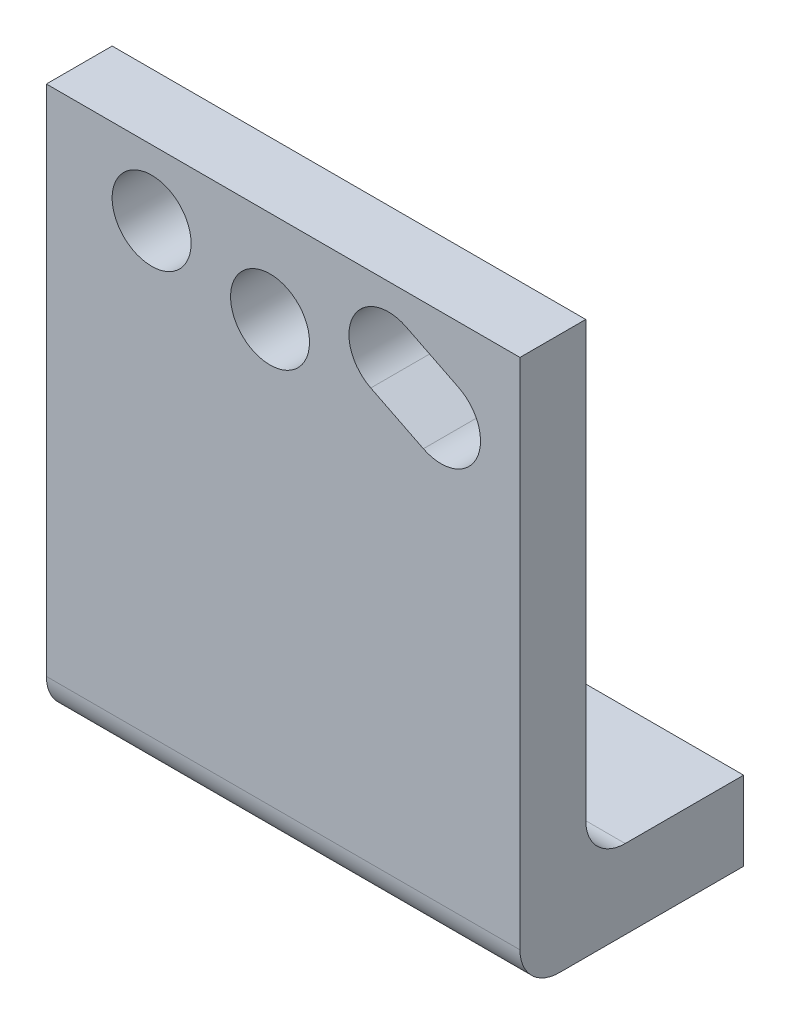
ISO-10303-21;
HEADER;
FILE_DESCRIPTION(('STEP AP214'),'2;1');
FILE_NAME('part.step','',(''),(''),'','','');
FILE_SCHEMA(('AUTOMOTIVE_DESIGN { 1 0 10303 214 1 1 1 1 }'));
ENDSEC;
DATA;
#1=APPLICATION_CONTEXT('core data for automotive mechanical design processes');
#2=APPLICATION_PROTOCOL_DEFINITION('international standard','automotive_design',2000,#1);
#3=PRODUCT_CONTEXT('',#1,'mechanical');
#4=PRODUCT('Part','Part','',(#3));
#5=PRODUCT_RELATED_PRODUCT_CATEGORY('part','',(#4));
#6=PRODUCT_DEFINITION_FORMATION('','',#4);
#7=PRODUCT_DEFINITION_CONTEXT('part definition',#1,'design');
#8=PRODUCT_DEFINITION('design','',#6,#7);
#9=PRODUCT_DEFINITION_SHAPE('','',#8);
#10=(LENGTH_UNIT() NAMED_UNIT(*) SI_UNIT(.MILLI.,.METRE.));
#11=(NAMED_UNIT(*) PLANE_ANGLE_UNIT() SI_UNIT($,.RADIAN.));
#12=(NAMED_UNIT(*) SI_UNIT($,.STERADIAN.) SOLID_ANGLE_UNIT());
#13=UNCERTAINTY_MEASURE_WITH_UNIT(LENGTH_MEASURE(1.E-05),#10,'distance_accuracy_value','');
#14=(GEOMETRIC_REPRESENTATION_CONTEXT(3) GLOBAL_UNCERTAINTY_ASSIGNED_CONTEXT((#13)) GLOBAL_UNIT_ASSIGNED_CONTEXT((#10,
#11,#12)) REPRESENTATION_CONTEXT('',''));
#15=CARTESIAN_POINT('',(0.,0.,0.));
#16=DIRECTION('',(0.,0.,1.));
#17=DIRECTION('',(1.,0.,0.));
#18=AXIS2_PLACEMENT_3D('',#15,#16,#17);
#19=CARTESIAN_POINT('',(0.,0.,0.));
#20=DIRECTION('',(0.,0.,1.));
#21=DIRECTION('',(1.,0.,0.));
#22=AXIS2_PLACEMENT_3D('',#19,#20,#21);
#23=PLANE('',#22);
#24=CARTESIAN_POINT('',(-5.,8.,0.));
#25=DIRECTION('',(0.,0.,1.));
#26=DIRECTION('',(1.,0.,0.));
#27=AXIS2_PLACEMENT_3D('',#24,#25,#26);
#28=CIRCLE('',#27,1.5);
#29=CARTESIAN_POINT('',(-3.5,8.,0.));
#30=VERTEX_POINT('',#29);
#31=EDGE_CURVE('E193',#30,#30,#28,.T.);
#32=ORIENTED_EDGE('',*,*,#31,.T.);
#33=EDGE_LOOP('',(#32));
#34=FACE_BOUND('',#33,.T.);
#35=CARTESIAN_POINT('',(6.,7.,0.));
#36=DIRECTION('',(0.,0.,1.));
#37=DIRECTION('',(1.,0.,0.));
#38=AXIS2_PLACEMENT_3D('',#35,#36,#37);
#39=CIRCLE('',#38,1.5);
#40=CARTESIAN_POINT('',(5.32917960675007,5.65835921350013,0.));
#41=VERTEX_POINT('',#40);
#42=CARTESIAN_POINT('',(6.67082039324994,8.34164078649988,0.));
#43=VERTEX_POINT('',#42);
#44=EDGE_CURVE('E181',#41,#43,#39,.T.);
#45=ORIENTED_EDGE('',*,*,#44,.T.);
#46=DIRECTION('',(0.894427190999916,-0.447213595499958,0.));
#47=VECTOR('',#46,1.);
#48=CARTESIAN_POINT('',(4.67082039324993,9.34164078649988,0.));
#49=LINE('',#48,#47);
#50=CARTESIAN_POINT('',(4.67082039324994,9.34164078649987,0.));
#51=VERTEX_POINT('',#50);
#52=EDGE_CURVE('E190',#51,#43,#49,.T.);
#53=ORIENTED_EDGE('',*,*,#52,.F.);
#54=CARTESIAN_POINT('',(4.,8.,0.));
#55=DIRECTION('',(0.,0.,1.));
#56=DIRECTION('',(1.,0.,0.));
#57=AXIS2_PLACEMENT_3D('',#54,#55,#56);
#58=CIRCLE('',#57,1.5);
#59=CARTESIAN_POINT('',(3.32917960675006,6.65835921350013,0.));
#60=VERTEX_POINT('',#59);
#61=EDGE_CURVE('E187',#51,#60,#58,.T.);
#62=ORIENTED_EDGE('',*,*,#61,.T.);
#63=DIRECTION('',(-0.894427190999916,0.447213595499958,0.));
#64=VECTOR('',#63,1.);
#65=CARTESIAN_POINT('',(3.32917960675006,6.65835921350013,0.));
#66=LINE('',#65,#64);
#67=EDGE_CURVE('E184',#41,#60,#66,.T.);
#68=ORIENTED_EDGE('',*,*,#67,.F.);
#69=EDGE_LOOP('',(#45,#53,#62,#68));
#70=FACE_BOUND('',#69,.T.);
#71=CARTESIAN_POINT('',(-0.499999999999998,7.,0.));
#72=DIRECTION('',(0.,0.,1.));
#73=DIRECTION('',(1.,0.,0.));
#74=AXIS2_PLACEMENT_3D('',#71,#72,#73);
#75=CIRCLE('',#74,1.5);
#76=CARTESIAN_POINT('',(1.,7.,0.));
#77=VERTEX_POINT('',#76);
#78=EDGE_CURVE('E150',#77,#77,#75,.T.);
#79=ORIENTED_EDGE('',*,*,#78,.T.);
#80=EDGE_LOOP('',(#79));
#81=FACE_BOUND('',#80,.T.);
#82=DIRECTION('',(0.,-1.,0.));
#83=VECTOR('',#82,1.);
#84=CARTESIAN_POINT('',(9.00000000000001,0.,0.));
#85=LINE('',#84,#83);
#86=CARTESIAN_POINT('',(9.,10.5,0.));
#87=VERTEX_POINT('',#86);
#88=CARTESIAN_POINT('',(9.00000000000001,-6.,0.));
#89=VERTEX_POINT('',#88);
#90=EDGE_CURVE('E198',#87,#89,#85,.T.);
#91=ORIENTED_EDGE('',*,*,#90,.T.);
#92=DIRECTION('',(1.,0.,0.));
#93=VECTOR('',#92,1.);
#94=CARTESIAN_POINT('',(-9.,-6.,0.));
#95=LINE('',#94,#93);
#96=CARTESIAN_POINT('',(-9.,-6.,0.));
#97=VERTEX_POINT('',#96);
#98=EDGE_CURVE('E56',#89,#97,#95,.F.);
#99=ORIENTED_EDGE('',*,*,#98,.T.);
#100=DIRECTION('',(0.,-1.,0.));
#101=VECTOR('',#100,1.);
#102=CARTESIAN_POINT('',(-9.,0.,0.));
#103=LINE('',#102,#101);
#104=CARTESIAN_POINT('',(-9.,10.5,0.));
#105=VERTEX_POINT('',#104);
#106=EDGE_CURVE('E196',#105,#97,#103,.T.);
#107=ORIENTED_EDGE('',*,*,#106,.F.);
#108=DIRECTION('',(1.,0.,0.));
#109=VECTOR('',#108,1.);
#110=CARTESIAN_POINT('',(0.,10.5,0.));
#111=LINE('',#110,#109);
#112=EDGE_CURVE('E156',#105,#87,#111,.T.);
#113=ORIENTED_EDGE('',*,*,#112,.T.);
#114=EDGE_LOOP('',(#91,#99,#107,#113));
#115=FACE_BOUND('',#114,.T.);
#116=ADVANCED_FACE('F35',(#34,#70,#81,#115),#23,.F.);
#117=CARTESIAN_POINT('',(-9.,0.,2.5));
#118=DIRECTION('',(1.,0.,0.));
#119=DIRECTION('',(0.,1.,0.));
#120=AXIS2_PLACEMENT_3D('',#117,#118,#119);
#121=PLANE('',#120);
#122=DIRECTION('',(0.,0.,-1.));
#123=VECTOR('',#122,1.);
#124=CARTESIAN_POINT('',(-9.,-10.5,2.5));
#125=LINE('',#124,#123);
#126=CARTESIAN_POINT('',(-9.,-10.5,1.));
#127=VERTEX_POINT('',#126);
#128=CARTESIAN_POINT('',(-9.,-10.5,-6.));
#129=VERTEX_POINT('',#128);
#130=EDGE_CURVE('E209',#127,#129,#125,.T.);
#131=ORIENTED_EDGE('',*,*,#130,.F.);
#132=CARTESIAN_POINT('',(-9.,-9.,1.));
#133=DIRECTION('',(1.,0.,0.));
#134=DIRECTION('',(0.,1.,0.));
#135=AXIS2_PLACEMENT_3D('',#132,#133,#134);
#136=CIRCLE('',#135,1.5);
#137=CARTESIAN_POINT('',(-9.,-9.,2.5));
#138=VERTEX_POINT('',#137);
#139=EDGE_CURVE('E224',#127,#138,#136,.F.);
#140=ORIENTED_EDGE('',*,*,#139,.T.);
#141=DIRECTION('',(0.,-1.,0.));
#142=VECTOR('',#141,1.);
#143=CARTESIAN_POINT('',(-9.,0.,2.5));
#144=LINE('',#143,#142);
#145=CARTESIAN_POINT('',(-9.,10.5,2.5));
#146=VERTEX_POINT('',#145);
#147=EDGE_CURVE('E169',#146,#138,#144,.T.);
#148=ORIENTED_EDGE('',*,*,#147,.F.);
#149=DIRECTION('',(0.,0.,-1.));
#150=VECTOR('',#149,1.);
#151=CARTESIAN_POINT('',(-9.,10.5,2.5));
#152=LINE('',#151,#150);
#153=EDGE_CURVE('E202',#146,#105,#152,.T.);
#154=ORIENTED_EDGE('',*,*,#153,.T.);
#155=ORIENTED_EDGE('',*,*,#106,.T.);
#156=CARTESIAN_POINT('',(-9.,-6.,-1.5));
#157=DIRECTION('',(1.,0.,0.));
#158=DIRECTION('',(0.,1.,0.));
#159=AXIS2_PLACEMENT_3D('',#156,#157,#158);
#160=CIRCLE('',#159,1.5);
#161=CARTESIAN_POINT('',(-9.,-7.5,-1.5));
#162=VERTEX_POINT('',#161);
#163=EDGE_CURVE('E11',#97,#162,#160,.T.);
#164=ORIENTED_EDGE('',*,*,#163,.T.);
#165=DIRECTION('',(0.,0.,1.));
#166=VECTOR('',#165,1.);
#167=CARTESIAN_POINT('',(-9.,-7.5,-6.));
#168=LINE('',#167,#166);
#169=CARTESIAN_POINT('',(-9.,-7.5,-6.));
#170=VERTEX_POINT('',#169);
#171=EDGE_CURVE('E122',#170,#162,#168,.T.);
#172=ORIENTED_EDGE('',*,*,#171,.F.);
#173=DIRECTION('',(0.,-1.,0.));
#174=VECTOR('',#173,1.);
#175=CARTESIAN_POINT('',(-9.,0.,-6.));
#176=LINE('',#175,#174);
#177=EDGE_CURVE('E127',#170,#129,#176,.T.);
#178=ORIENTED_EDGE('',*,*,#177,.T.);
#179=EDGE_LOOP('',(#131,#140,#148,#154,#155,#164,#172,#178));
#180=FACE_BOUND('',#179,.T.);
#181=ADVANCED_FACE('F125',(#180),#121,.F.);
#182=CARTESIAN_POINT('',(0.,-10.5,2.5));
#183=DIRECTION('',(0.,1.,0.));
#184=DIRECTION('',(0.,0.,1.));
#185=AXIS2_PLACEMENT_3D('',#182,#183,#184);
#186=PLANE('',#185);
#187=DIRECTION('',(0.,0.,-1.));
#188=VECTOR('',#187,1.);
#189=CARTESIAN_POINT('',(9.00000000000001,-10.5,2.5));
#190=LINE('',#189,#188);
#191=CARTESIAN_POINT('',(9.00000000000001,-10.5,1.));
#192=VERTEX_POINT('',#191);
#193=CARTESIAN_POINT('',(9.00000000000001,-10.5,-6.));
#194=VERTEX_POINT('',#193);
#195=EDGE_CURVE('E207',#192,#194,#190,.T.);
#196=ORIENTED_EDGE('',*,*,#195,.F.);
#197=DIRECTION('',(1.,0.,0.));
#198=VECTOR('',#197,1.);
#199=CARTESIAN_POINT('',(-9.,-10.5,1.));
#200=LINE('',#199,#198);
#201=EDGE_CURVE('E222',#192,#127,#200,.F.);
#202=ORIENTED_EDGE('',*,*,#201,.T.);
#203=ORIENTED_EDGE('',*,*,#130,.T.);
#204=DIRECTION('',(1.,0.,0.));
#205=VECTOR('',#204,1.);
#206=CARTESIAN_POINT('',(0.,-10.5,-6.));
#207=LINE('',#206,#205);
#208=EDGE_CURVE('E145',#129,#194,#207,.T.);
#209=ORIENTED_EDGE('',*,*,#208,.T.);
#210=EDGE_LOOP('',(#196,#202,#203,#209));
#211=FACE_BOUND('',#210,.T.);
#212=ADVANCED_FACE('F245',(#211),#186,.F.);
#213=CARTESIAN_POINT('',(9.00000000000001,0.,2.5));
#214=DIRECTION('',(1.,0.,0.));
#215=DIRECTION('',(0.,1.,0.));
#216=AXIS2_PLACEMENT_3D('',#213,#214,#215);
#217=PLANE('',#216);
#218=DIRECTION('',(0.,-1.,0.));
#219=VECTOR('',#218,1.);
#220=CARTESIAN_POINT('',(9.00000000000001,0.,2.5));
#221=LINE('',#220,#219);
#222=CARTESIAN_POINT('',(9.,10.5,2.5));
#223=VERTEX_POINT('',#222);
#224=CARTESIAN_POINT('',(9.00000000000001,-9.,2.5));
#225=VERTEX_POINT('',#224);
#226=EDGE_CURVE('E172',#223,#225,#221,.T.);
#227=ORIENTED_EDGE('',*,*,#226,.T.);
#228=CARTESIAN_POINT('',(9.00000000000001,-9.,1.));
#229=DIRECTION('',(1.,0.,0.));
#230=DIRECTION('',(0.,1.,0.));
#231=AXIS2_PLACEMENT_3D('',#228,#229,#230);
#232=CIRCLE('',#231,1.5);
#233=EDGE_CURVE('E220',#225,#192,#232,.T.);
#234=ORIENTED_EDGE('',*,*,#233,.T.);
#235=ORIENTED_EDGE('',*,*,#195,.T.);
#236=DIRECTION('',(0.,-1.,0.));
#237=VECTOR('',#236,1.);
#238=CARTESIAN_POINT('',(9.00000000000001,0.,-6.));
#239=LINE('',#238,#237);
#240=CARTESIAN_POINT('',(9.00000000000001,-7.5,-6.));
#241=VERTEX_POINT('',#240);
#242=EDGE_CURVE('E132',#241,#194,#239,.T.);
#243=ORIENTED_EDGE('',*,*,#242,.F.);
#244=DIRECTION('',(0.,0.,1.));
#245=VECTOR('',#244,1.);
#246=CARTESIAN_POINT('',(9.00000000000001,-7.5,-6.));
#247=LINE('',#246,#245);
#248=CARTESIAN_POINT('',(9.00000000000001,-7.5,-1.5));
#249=VERTEX_POINT('',#248);
#250=EDGE_CURVE('E131',#241,#249,#247,.T.);
#251=ORIENTED_EDGE('',*,*,#250,.T.);
#252=CARTESIAN_POINT('',(9.00000000000001,-6.,-1.5));
#253=DIRECTION('',(1.,0.,0.));
#254=DIRECTION('',(0.,1.,0.));
#255=AXIS2_PLACEMENT_3D('',#252,#253,#254);
#256=CIRCLE('',#255,1.5);
#257=EDGE_CURVE('E43',#249,#89,#256,.F.);
#258=ORIENTED_EDGE('',*,*,#257,.T.);
#259=ORIENTED_EDGE('',*,*,#90,.F.);
#260=DIRECTION('',(0.,0.,-1.));
#261=VECTOR('',#260,1.);
#262=CARTESIAN_POINT('',(9.,10.5,2.5));
#263=LINE('',#262,#261);
#264=EDGE_CURVE('E204',#223,#87,#263,.T.);
#265=ORIENTED_EDGE('',*,*,#264,.F.);
#266=EDGE_LOOP('',(#227,#234,#235,#243,#251,#258,#259,#265));
#267=FACE_BOUND('',#266,.T.);
#268=ADVANCED_FACE('F230',(#267),#217,.T.);
#269=CARTESIAN_POINT('',(6.,7.,2.5));
#270=DIRECTION('',(0.,0.,-1.));
#271=DIRECTION('',(-1.,0.,0.));
#272=AXIS2_PLACEMENT_3D('',#269,#270,#271);
#273=CYLINDRICAL_SURFACE('',#272,1.5);
#274=ORIENTED_EDGE('',*,*,#44,.F.);
#275=DIRECTION('',(0.,0.,-1.));
#276=VECTOR('',#275,1.);
#277=CARTESIAN_POINT('',(5.32917960675007,5.65835921350013,2.5));
#278=LINE('',#277,#276);
#279=CARTESIAN_POINT('',(5.32917960675007,5.65835921350013,2.5));
#280=VERTEX_POINT('',#279);
#281=EDGE_CURVE('E205',#280,#41,#278,.T.);
#282=ORIENTED_EDGE('',*,*,#281,.F.);
#283=CARTESIAN_POINT('',(6.,7.,2.5));
#284=DIRECTION('',(0.,0.,1.));
#285=DIRECTION('',(1.,0.,0.));
#286=AXIS2_PLACEMENT_3D('',#283,#284,#285);
#287=CIRCLE('',#286,1.5);
#288=CARTESIAN_POINT('',(6.67082039324994,8.34164078649988,2.5));
#289=VERTEX_POINT('',#288);
#290=EDGE_CURVE('E155',#280,#289,#287,.T.);
#291=ORIENTED_EDGE('',*,*,#290,.T.);
#292=DIRECTION('',(0.,0.,-1.));
#293=VECTOR('',#292,1.);
#294=CARTESIAN_POINT('',(6.67082039324994,8.34164078649988,2.5));
#295=LINE('',#294,#293);
#296=EDGE_CURVE('E178',#289,#43,#295,.T.);
#297=ORIENTED_EDGE('',*,*,#296,.T.);
#298=EDGE_LOOP('',(#274,#282,#291,#297));
#299=FACE_BOUND('',#298,.T.);
#300=ADVANCED_FACE('F259',(#299),#273,.F.);
#301=CARTESIAN_POINT('',(3.32917960675006,6.65835921350013,2.5));
#302=DIRECTION('',(-0.447213595499958,-0.894427190999916,0.));
#303=DIRECTION('',(0.894427190999916,-0.447213595499958,0.));
#304=AXIS2_PLACEMENT_3D('',#301,#302,#303);
#305=PLANE('',#304);
#306=ORIENTED_EDGE('',*,*,#67,.T.);
#307=DIRECTION('',(0.,0.,-1.));
#308=VECTOR('',#307,1.);
#309=CARTESIAN_POINT('',(3.32917960675006,6.65835921350013,2.5));
#310=LINE('',#309,#308);
#311=CARTESIAN_POINT('',(3.32917960675006,6.65835921350013,2.5));
#312=VERTEX_POINT('',#311);
#313=EDGE_CURVE('E215',#312,#60,#310,.T.);
#314=ORIENTED_EDGE('',*,*,#313,.F.);
#315=DIRECTION('',(-0.894427190999916,0.447213595499958,0.));
#316=VECTOR('',#315,1.);
#317=CARTESIAN_POINT('',(3.32917960675006,6.65835921350013,2.5));
#318=LINE('',#317,#316);
#319=EDGE_CURVE('E159',#280,#312,#318,.T.);
#320=ORIENTED_EDGE('',*,*,#319,.F.);
#321=ORIENTED_EDGE('',*,*,#281,.T.);
#322=EDGE_LOOP('',(#306,#314,#320,#321));
#323=FACE_BOUND('',#322,.T.);
#324=ADVANCED_FACE('F274',(#323),#305,.F.);
#325=CARTESIAN_POINT('',(4.,8.,2.5));
#326=DIRECTION('',(0.,0.,-1.));
#327=DIRECTION('',(-1.,0.,0.));
#328=AXIS2_PLACEMENT_3D('',#325,#326,#327);
#329=CYLINDRICAL_SURFACE('',#328,1.5);
#330=ORIENTED_EDGE('',*,*,#61,.F.);
#331=DIRECTION('',(0.,0.,-1.));
#332=VECTOR('',#331,1.);
#333=CARTESIAN_POINT('',(4.67082039324994,9.34164078649987,2.5));
#334=LINE('',#333,#332);
#335=CARTESIAN_POINT('',(4.67082039324994,9.34164078649987,2.5));
#336=VERTEX_POINT('',#335);
#337=EDGE_CURVE('E213',#336,#51,#334,.T.);
#338=ORIENTED_EDGE('',*,*,#337,.F.);
#339=CARTESIAN_POINT('',(4.,8.,2.5));
#340=DIRECTION('',(0.,0.,1.));
#341=DIRECTION('',(1.,0.,0.));
#342=AXIS2_PLACEMENT_3D('',#339,#340,#341);
#343=CIRCLE('',#342,1.5);
#344=EDGE_CURVE('E161',#336,#312,#343,.T.);
#345=ORIENTED_EDGE('',*,*,#344,.T.);
#346=ORIENTED_EDGE('',*,*,#313,.T.);
#347=EDGE_LOOP('',(#330,#338,#345,#346));
#348=FACE_BOUND('',#347,.T.);
#349=ADVANCED_FACE('F267',(#348),#329,.F.);
#350=CARTESIAN_POINT('',(-5.,8.,2.5));
#351=DIRECTION('',(0.,0.,-1.));
#352=DIRECTION('',(-1.,0.,0.));
#353=AXIS2_PLACEMENT_3D('',#350,#351,#352);
#354=CYLINDRICAL_SURFACE('',#353,1.5);
#355=CARTESIAN_POINT('',(-5.,8.,2.5));
#356=DIRECTION('',(0.,0.,1.));
#357=DIRECTION('',(1.,0.,0.));
#358=AXIS2_PLACEMENT_3D('',#355,#356,#357);
#359=CIRCLE('',#358,1.5);
#360=CARTESIAN_POINT('',(-3.5,8.,2.5));
#361=VERTEX_POINT('',#360);
#362=EDGE_CURVE('E166',#361,#361,#359,.T.);
#363=ORIENTED_EDGE('',*,*,#362,.T.);
#364=EDGE_LOOP('',(#363));
#365=FACE_BOUND('',#364,.T.);
#366=ORIENTED_EDGE('',*,*,#31,.F.);
#367=EDGE_LOOP('',(#366));
#368=FACE_BOUND('',#367,.T.);
#369=ADVANCED_FACE('F263',(#365,#368),#354,.F.);
#370=CARTESIAN_POINT('',(4.67082039324993,9.34164078649988,2.5));
#371=DIRECTION('',(0.447213595499958,0.894427190999916,0.));
#372=DIRECTION('',(-0.894427190999916,0.447213595499958,0.));
#373=AXIS2_PLACEMENT_3D('',#370,#371,#372);
#374=PLANE('',#373);
#375=ORIENTED_EDGE('',*,*,#52,.T.);
#376=ORIENTED_EDGE('',*,*,#296,.F.);
#377=DIRECTION('',(0.894427190999916,-0.447213595499958,0.));
#378=VECTOR('',#377,1.);
#379=CARTESIAN_POINT('',(4.67082039324993,9.34164078649988,2.5));
#380=LINE('',#379,#378);
#381=EDGE_CURVE('E164',#336,#289,#380,.T.);
#382=ORIENTED_EDGE('',*,*,#381,.F.);
#383=ORIENTED_EDGE('',*,*,#337,.T.);
#384=EDGE_LOOP('',(#375,#376,#382,#383));
#385=FACE_BOUND('',#384,.T.);
#386=ADVANCED_FACE('F266',(#385),#374,.F.);
#387=CARTESIAN_POINT('',(-0.499999999999998,7.,2.5));
#388=DIRECTION('',(0.,0.,-1.));
#389=DIRECTION('',(-1.,0.,0.));
#390=AXIS2_PLACEMENT_3D('',#387,#388,#389);
#391=CYLINDRICAL_SURFACE('',#390,1.5);
#392=CARTESIAN_POINT('',(-0.499999999999998,7.,2.5));
#393=DIRECTION('',(0.,0.,1.));
#394=DIRECTION('',(1.,0.,0.));
#395=AXIS2_PLACEMENT_3D('',#392,#393,#394);
#396=CIRCLE('',#395,1.5);
#397=CARTESIAN_POINT('',(1.,7.,2.5));
#398=VERTEX_POINT('',#397);
#399=EDGE_CURVE('E152',#398,#398,#396,.T.);
#400=ORIENTED_EDGE('',*,*,#399,.T.);
#401=EDGE_LOOP('',(#400));
#402=FACE_BOUND('',#401,.T.);
#403=ORIENTED_EDGE('',*,*,#78,.F.);
#404=EDGE_LOOP('',(#403));
#405=FACE_BOUND('',#404,.T.);
#406=ADVANCED_FACE('F255',(#402,#405),#391,.F.);
#407=CARTESIAN_POINT('',(0.,10.5,2.5));
#408=DIRECTION('',(0.,1.,0.));
#409=DIRECTION('',(0.,0.,1.));
#410=AXIS2_PLACEMENT_3D('',#407,#408,#409);
#411=PLANE('',#410);
#412=ORIENTED_EDGE('',*,*,#112,.F.);
#413=ORIENTED_EDGE('',*,*,#153,.F.);
#414=DIRECTION('',(1.,0.,0.));
#415=VECTOR('',#414,1.);
#416=CARTESIAN_POINT('',(0.,10.5,2.5));
#417=LINE('',#416,#415);
#418=EDGE_CURVE('E175',#146,#223,#417,.T.);
#419=ORIENTED_EDGE('',*,*,#418,.T.);
#420=ORIENTED_EDGE('',*,*,#264,.T.);
#421=EDGE_LOOP('',(#412,#413,#419,#420));
#422=FACE_BOUND('',#421,.T.);
#423=ADVANCED_FACE('F252',(#422),#411,.T.);
#424=CARTESIAN_POINT('',(0.,0.,2.5));
#425=DIRECTION('',(0.,0.,1.));
#426=DIRECTION('',(1.,0.,0.));
#427=AXIS2_PLACEMENT_3D('',#424,#425,#426);
#428=PLANE('',#427);
#429=ORIENTED_EDGE('',*,*,#399,.F.);
#430=EDGE_LOOP('',(#429));
#431=FACE_BOUND('',#430,.T.);
#432=ORIENTED_EDGE('',*,*,#290,.F.);
#433=ORIENTED_EDGE('',*,*,#319,.T.);
#434=ORIENTED_EDGE('',*,*,#344,.F.);
#435=ORIENTED_EDGE('',*,*,#381,.T.);
#436=EDGE_LOOP('',(#432,#433,#434,#435));
#437=FACE_BOUND('',#436,.T.);
#438=ORIENTED_EDGE('',*,*,#362,.F.);
#439=EDGE_LOOP('',(#438));
#440=FACE_BOUND('',#439,.T.);
#441=ORIENTED_EDGE('',*,*,#147,.T.);
#442=DIRECTION('',(1.,0.,0.));
#443=VECTOR('',#442,1.);
#444=CARTESIAN_POINT('',(9.00000000000001,-9.,2.5));
#445=LINE('',#444,#443);
#446=EDGE_CURVE('E211',#138,#225,#445,.T.);
#447=ORIENTED_EDGE('',*,*,#446,.T.);
#448=ORIENTED_EDGE('',*,*,#226,.F.);
#449=ORIENTED_EDGE('',*,*,#418,.F.);
#450=EDGE_LOOP('',(#441,#447,#448,#449));
#451=FACE_BOUND('',#450,.T.);
#452=ADVANCED_FACE('F250',(#431,#437,#440,#451),#428,.T.);
#453=CARTESIAN_POINT('',(0.,-7.5,-6.));
#454=DIRECTION('',(0.,-1.,0.));
#455=DIRECTION('',(1.,0.,0.));
#456=AXIS2_PLACEMENT_3D('',#453,#454,#455);
#457=PLANE('',#456);
#458=ORIENTED_EDGE('',*,*,#171,.T.);
#459=DIRECTION('',(1.,0.,0.));
#460=VECTOR('',#459,1.);
#461=CARTESIAN_POINT('',(9.00000000000001,-7.5,-1.5));
#462=LINE('',#461,#460);
#463=EDGE_CURVE('E226',#162,#249,#462,.T.);
#464=ORIENTED_EDGE('',*,*,#463,.T.);
#465=ORIENTED_EDGE('',*,*,#250,.F.);
#466=DIRECTION('',(1.,0.,0.));
#467=VECTOR('',#466,1.);
#468=CARTESIAN_POINT('',(0.,-7.5,-6.));
#469=LINE('',#468,#467);
#470=EDGE_CURVE('E136',#170,#241,#469,.T.);
#471=ORIENTED_EDGE('',*,*,#470,.F.);
#472=EDGE_LOOP('',(#458,#464,#465,#471));
#473=FACE_BOUND('',#472,.T.);
#474=ADVANCED_FACE('F137',(#473),#457,.F.);
#475=CARTESIAN_POINT('',(0.,0.,-6.));
#476=DIRECTION('',(0.,0.,1.));
#477=DIRECTION('',(1.,0.,0.));
#478=AXIS2_PLACEMENT_3D('',#475,#476,#477);
#479=PLANE('',#478);
#480=ORIENTED_EDGE('',*,*,#470,.T.);
#481=ORIENTED_EDGE('',*,*,#242,.T.);
#482=ORIENTED_EDGE('',*,*,#208,.F.);
#483=ORIENTED_EDGE('',*,*,#177,.F.);
#484=EDGE_LOOP('',(#480,#481,#482,#483));
#485=FACE_BOUND('',#484,.T.);
#486=ADVANCED_FACE('F143',(#485),#479,.F.);
#487=CARTESIAN_POINT('',(0.,-9.,1.));
#488=DIRECTION('',(-1.,0.,0.));
#489=DIRECTION('',(0.,0.,1.));
#490=AXIS2_PLACEMENT_3D('',#487,#488,#489);
#491=CYLINDRICAL_SURFACE('',#490,1.5);
#492=ORIENTED_EDGE('',*,*,#139,.F.);
#493=ORIENTED_EDGE('',*,*,#201,.F.);
#494=ORIENTED_EDGE('',*,*,#233,.F.);
#495=ORIENTED_EDGE('',*,*,#446,.F.);
#496=EDGE_LOOP('',(#492,#493,#494,#495));
#497=FACE_BOUND('',#496,.T.);
#498=ADVANCED_FACE('F234',(#497),#491,.T.);
#499=CARTESIAN_POINT('',(0.,-6.,-1.5));
#500=DIRECTION('',(-1.,0.,0.));
#501=DIRECTION('',(0.,-1.,0.));
#502=AXIS2_PLACEMENT_3D('',#499,#500,#501);
#503=CYLINDRICAL_SURFACE('',#502,1.5);
#504=ORIENTED_EDGE('',*,*,#163,.F.);
#505=ORIENTED_EDGE('',*,*,#98,.F.);
#506=ORIENTED_EDGE('',*,*,#257,.F.);
#507=ORIENTED_EDGE('',*,*,#463,.F.);
#508=EDGE_LOOP('',(#504,#505,#506,#507));
#509=FACE_BOUND('',#508,.T.);
#510=ADVANCED_FACE('F37',(#509),#503,.F.);
#511=CLOSED_SHELL('',(#116,#181,#212,#268,#300,#324,#349,#369,#386,#406,#423,#452,#474,#486,
#498,#510));
#512=MANIFOLD_SOLID_BREP('B2',#511);
#513=ADVANCED_BREP_SHAPE_REPRESENTATION('',(#18,#512),#14);
#514=SHAPE_DEFINITION_REPRESENTATION(#9,#513);
ENDSEC;
END-ISO-10303-21;
